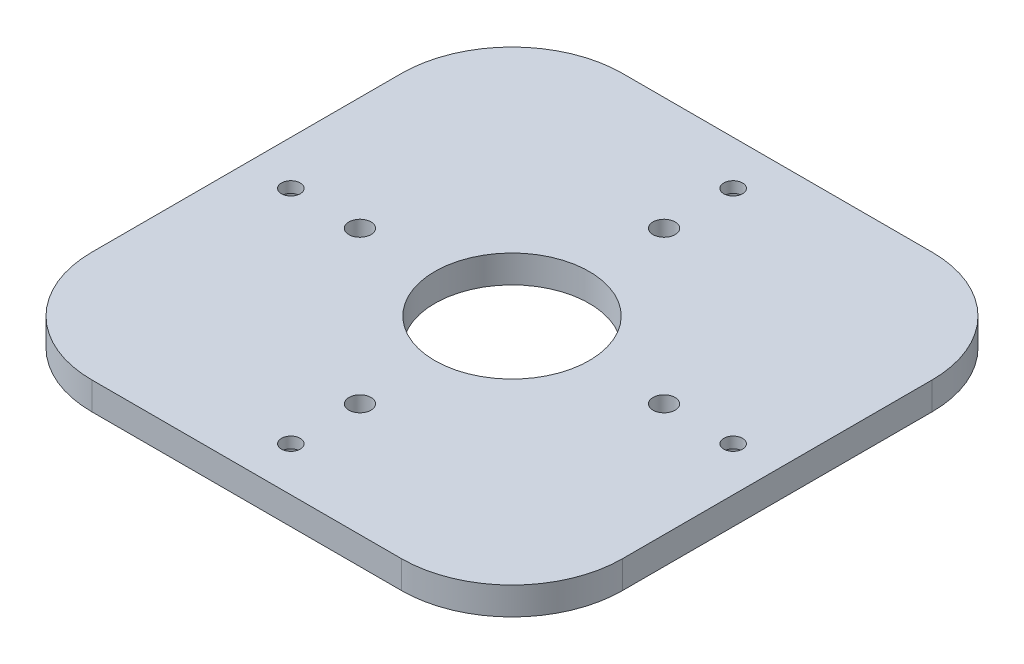
ISO-10303-21;
HEADER;
FILE_DESCRIPTION(('STEP AP214'),'2;1');
FILE_NAME('part.step','',(''),(''),'','','');
FILE_SCHEMA(('AUTOMOTIVE_DESIGN { 1 0 10303 214 1 1 1 1 }'));
ENDSEC;
DATA;
#1=APPLICATION_CONTEXT('core data for automotive mechanical design processes');
#2=APPLICATION_PROTOCOL_DEFINITION('international standard','automotive_design',2000,#1);
#3=PRODUCT_CONTEXT('',#1,'mechanical');
#4=PRODUCT('Part','Part','',(#3));
#5=PRODUCT_RELATED_PRODUCT_CATEGORY('part','',(#4));
#6=PRODUCT_DEFINITION_FORMATION('','',#4);
#7=PRODUCT_DEFINITION_CONTEXT('part definition',#1,'design');
#8=PRODUCT_DEFINITION('design','',#6,#7);
#9=PRODUCT_DEFINITION_SHAPE('','',#8);
#10=(LENGTH_UNIT() NAMED_UNIT(*) SI_UNIT(.MILLI.,.METRE.));
#11=(NAMED_UNIT(*) PLANE_ANGLE_UNIT() SI_UNIT($,.RADIAN.));
#12=(NAMED_UNIT(*) SI_UNIT($,.STERADIAN.) SOLID_ANGLE_UNIT());
#13=UNCERTAINTY_MEASURE_WITH_UNIT(LENGTH_MEASURE(1.E-05),#10,'distance_accuracy_value','');
#14=(GEOMETRIC_REPRESENTATION_CONTEXT(3) GLOBAL_UNCERTAINTY_ASSIGNED_CONTEXT((#13)) GLOBAL_UNIT_ASSIGNED_CONTEXT((#10,
#11,#12)) REPRESENTATION_CONTEXT('',''));
#15=CARTESIAN_POINT('',(0.,0.,0.));
#16=DIRECTION('',(0.,0.,1.));
#17=DIRECTION('',(1.,0.,0.));
#18=AXIS2_PLACEMENT_3D('',#15,#16,#17);
#19=CARTESIAN_POINT('',(0.,5.,0.));
#20=DIRECTION('',(0.,1.,0.));
#21=DIRECTION('',(0.,0.,1.));
#22=AXIS2_PLACEMENT_3D('',#19,#20,#21);
#23=PLANE('',#22);
#24=CARTESIAN_POINT('',(-27.5,5.,0.));
#25=DIRECTION('',(0.,-1.,0.));
#26=DIRECTION('',(0.,0.,-1.));
#27=AXIS2_PLACEMENT_3D('',#24,#25,#26);
#28=CIRCLE('',#27,2.);
#29=CARTESIAN_POINT('',(-27.5,5.,-2.));
#30=VERTEX_POINT('',#29);
#31=EDGE_CURVE('E250',#30,#30,#28,.T.);
#32=ORIENTED_EDGE('',*,*,#31,.T.);
#33=EDGE_LOOP('',(#32));
#34=FACE_BOUND('',#33,.T.);
#35=CARTESIAN_POINT('',(0.,5.,27.5));
#36=DIRECTION('',(0.,-1.,0.));
#37=DIRECTION('',(0.,0.,-1.));
#38=AXIS2_PLACEMENT_3D('',#35,#36,#37);
#39=CIRCLE('',#38,2.);
#40=CARTESIAN_POINT('',(0.,5.,25.5));
#41=VERTEX_POINT('',#40);
#42=EDGE_CURVE('E263',#41,#41,#39,.T.);
#43=ORIENTED_EDGE('',*,*,#42,.T.);
#44=EDGE_LOOP('',(#43));
#45=FACE_BOUND('',#44,.T.);
#46=CARTESIAN_POINT('',(27.5,5.,-1.92031473636372E-13));
#47=DIRECTION('',(0.,-1.,0.));
#48=DIRECTION('',(0.,0.,-1.));
#49=AXIS2_PLACEMENT_3D('',#46,#47,#48);
#50=CIRCLE('',#49,2.);
#51=CARTESIAN_POINT('',(27.5,5.,-2.00000000000019));
#52=VERTEX_POINT('',#51);
#53=EDGE_CURVE('E257',#52,#52,#50,.T.);
#54=ORIENTED_EDGE('',*,*,#53,.T.);
#55=EDGE_LOOP('',(#54));
#56=FACE_BOUND('',#55,.T.);
#57=CARTESIAN_POINT('',(-2.88047210454558E-13,5.,-27.5));
#58=DIRECTION('',(0.,-1.,0.));
#59=DIRECTION('',(0.,0.,-1.));
#60=AXIS2_PLACEMENT_3D('',#57,#58,#59);
#61=CIRCLE('',#60,2.);
#62=CARTESIAN_POINT('',(-2.88047210454558E-13,5.,-29.5));
#63=VERTEX_POINT('',#62);
#64=EDGE_CURVE('E251',#63,#63,#61,.T.);
#65=ORIENTED_EDGE('',*,*,#64,.T.);
#66=EDGE_LOOP('',(#65));
#67=FACE_BOUND('',#66,.T.);
#68=CARTESIAN_POINT('',(-40.,5.,0.));
#69=DIRECTION('',(0.,-1.,0.));
#70=DIRECTION('',(0.,0.,-1.));
#71=AXIS2_PLACEMENT_3D('',#68,#69,#70);
#72=CIRCLE('',#71,1.7);
#73=CARTESIAN_POINT('',(-40.,5.,-1.70000000000002));
#74=VERTEX_POINT('',#73);
#75=EDGE_CURVE('E235',#74,#74,#72,.T.);
#76=ORIENTED_EDGE('',*,*,#75,.T.);
#77=EDGE_LOOP('',(#76));
#78=FACE_BOUND('',#77,.T.);
#79=CARTESIAN_POINT('',(0.,5.,40.));
#80=DIRECTION('',(0.,-1.,0.));
#81=DIRECTION('',(0.,0.,-1.));
#82=AXIS2_PLACEMENT_3D('',#79,#80,#81);
#83=CIRCLE('',#82,1.7);
#84=CARTESIAN_POINT('',(0.,5.,38.3));
#85=VERTEX_POINT('',#84);
#86=EDGE_CURVE('E220',#85,#85,#83,.T.);
#87=ORIENTED_EDGE('',*,*,#86,.T.);
#88=EDGE_LOOP('',(#87));
#89=FACE_BOUND('',#88,.T.);
#90=CARTESIAN_POINT('',(40.,5.,0.));
#91=DIRECTION('',(0.,-1.,0.));
#92=DIRECTION('',(0.,0.,-1.));
#93=AXIS2_PLACEMENT_3D('',#90,#91,#92);
#94=CIRCLE('',#93,1.7);
#95=CARTESIAN_POINT('',(40.,5.,-1.70000000000002));
#96=VERTEX_POINT('',#95);
#97=EDGE_CURVE('E205',#96,#96,#94,.T.);
#98=ORIENTED_EDGE('',*,*,#97,.T.);
#99=EDGE_LOOP('',(#98));
#100=FACE_BOUND('',#99,.T.);
#101=CARTESIAN_POINT('',(0.,5.,-40.));
#102=DIRECTION('',(0.,-1.,0.));
#103=DIRECTION('',(0.,0.,-1.));
#104=AXIS2_PLACEMENT_3D('',#101,#102,#103);
#105=CIRCLE('',#104,1.7);
#106=CARTESIAN_POINT('',(0.,5.,-41.7));
#107=VERTEX_POINT('',#106);
#108=EDGE_CURVE('E189',#107,#107,#105,.T.);
#109=ORIENTED_EDGE('',*,*,#108,.T.);
#110=EDGE_LOOP('',(#109));
#111=FACE_BOUND('',#110,.T.);
#112=DIRECTION('',(-1.,0.,0.));
#113=VECTOR('',#112,1.);
#114=CARTESIAN_POINT('',(-48.,5.,-48.));
#115=LINE('',#114,#113);
#116=CARTESIAN_POINT('',(28.,5.,-48.));
#117=VERTEX_POINT('',#116);
#118=CARTESIAN_POINT('',(-28.,5.,-48.));
#119=VERTEX_POINT('',#118);
#120=EDGE_CURVE('E144',#117,#119,#115,.T.);
#121=ORIENTED_EDGE('',*,*,#120,.T.);
#122=CARTESIAN_POINT('',(-28.,5.,-28.));
#123=DIRECTION('',(0.,1.,0.));
#124=DIRECTION('',(0.,0.,1.));
#125=AXIS2_PLACEMENT_3D('',#122,#123,#124);
#126=CIRCLE('',#125,20.);
#127=CARTESIAN_POINT('',(-48.,5.,-28.));
#128=VERTEX_POINT('',#127);
#129=EDGE_CURVE('E163',#119,#128,#126,.T.);
#130=ORIENTED_EDGE('',*,*,#129,.T.);
#131=DIRECTION('',(0.,0.,1.));
#132=VECTOR('',#131,1.);
#133=CARTESIAN_POINT('',(-48.,5.,-48.));
#134=LINE('',#133,#132);
#135=CARTESIAN_POINT('',(-48.,5.,28.));
#136=VERTEX_POINT('',#135);
#137=EDGE_CURVE('E127',#128,#136,#134,.T.);
#138=ORIENTED_EDGE('',*,*,#137,.T.);
#139=CARTESIAN_POINT('',(-28.,5.,28.));
#140=DIRECTION('',(0.,1.,0.));
#141=DIRECTION('',(0.,0.,1.));
#142=AXIS2_PLACEMENT_3D('',#139,#140,#141);
#143=CIRCLE('',#142,20.);
#144=CARTESIAN_POINT('',(-28.,5.,48.));
#145=VERTEX_POINT('',#144);
#146=EDGE_CURVE('E158',#136,#145,#143,.T.);
#147=ORIENTED_EDGE('',*,*,#146,.T.);
#148=DIRECTION('',(1.,0.,0.));
#149=VECTOR('',#148,1.);
#150=CARTESIAN_POINT('',(-48.,5.,48.));
#151=LINE('',#150,#149);
#152=CARTESIAN_POINT('',(28.,5.,48.));
#153=VERTEX_POINT('',#152);
#154=EDGE_CURVE('E174',#145,#153,#151,.T.);
#155=ORIENTED_EDGE('',*,*,#154,.T.);
#156=CARTESIAN_POINT('',(28.,5.,28.));
#157=DIRECTION('',(0.,1.,0.));
#158=DIRECTION('',(0.,0.,1.));
#159=AXIS2_PLACEMENT_3D('',#156,#157,#158);
#160=CIRCLE('',#159,20.);
#161=CARTESIAN_POINT('',(48.,5.,28.));
#162=VERTEX_POINT('',#161);
#163=EDGE_CURVE('E63',#153,#162,#160,.T.);
#164=ORIENTED_EDGE('',*,*,#163,.T.);
#165=DIRECTION('',(0.,0.,-1.));
#166=VECTOR('',#165,1.);
#167=CARTESIAN_POINT('',(48.,5.,-48.));
#168=LINE('',#167,#166);
#169=CARTESIAN_POINT('',(48.,5.,-28.));
#170=VERTEX_POINT('',#169);
#171=EDGE_CURVE('E182',#162,#170,#168,.T.);
#172=ORIENTED_EDGE('',*,*,#171,.T.);
#173=CARTESIAN_POINT('',(28.,5.,-28.));
#174=DIRECTION('',(0.,1.,0.));
#175=DIRECTION('',(0.,0.,1.));
#176=AXIS2_PLACEMENT_3D('',#173,#174,#175);
#177=CIRCLE('',#176,20.);
#178=EDGE_CURVE('E161',#170,#117,#177,.T.);
#179=ORIENTED_EDGE('',*,*,#178,.T.);
#180=EDGE_LOOP('',(#121,#130,#138,#147,#155,#164,#172,#179));
#181=FACE_BOUND('',#180,.T.);
#182=CARTESIAN_POINT('',(0.,5.,0.));
#183=DIRECTION('',(0.,1.,0.));
#184=DIRECTION('',(0.,0.,1.));
#185=AXIS2_PLACEMENT_3D('',#182,#183,#184);
#186=CIRCLE('',#185,13.97);
#187=CARTESIAN_POINT('',(0.,5.,13.97));
#188=VERTEX_POINT('',#187);
#189=EDGE_CURVE('E135',#188,#188,#186,.T.);
#190=ORIENTED_EDGE('',*,*,#189,.F.);
#191=EDGE_LOOP('',(#190));
#192=FACE_BOUND('',#191,.T.);
#193=ADVANCED_FACE('F41',(#34,#45,#56,#67,#78,#89,#100,#111,#181,#192),#23,.T.);
#194=CARTESIAN_POINT('',(0.,0.,0.));
#195=DIRECTION('',(0.,1.,0.));
#196=DIRECTION('',(0.,0.,1.));
#197=AXIS2_PLACEMENT_3D('',#194,#195,#196);
#198=PLANE('',#197);
#199=CARTESIAN_POINT('',(-27.5,0.,0.));
#200=DIRECTION('',(0.,-1.,0.));
#201=DIRECTION('',(0.,0.,-1.));
#202=AXIS2_PLACEMENT_3D('',#199,#200,#201);
#203=CIRCLE('',#202,2.);
#204=CARTESIAN_POINT('',(-27.5,0.,-2.));
#205=VERTEX_POINT('',#204);
#206=EDGE_CURVE('E269',#205,#205,#203,.T.);
#207=ORIENTED_EDGE('',*,*,#206,.F.);
#208=EDGE_LOOP('',(#207));
#209=FACE_BOUND('',#208,.T.);
#210=CARTESIAN_POINT('',(0.,0.,27.5));
#211=DIRECTION('',(0.,-1.,0.));
#212=DIRECTION('',(0.,0.,-1.));
#213=AXIS2_PLACEMENT_3D('',#210,#211,#212);
#214=CIRCLE('',#213,2.);
#215=CARTESIAN_POINT('',(0.,0.,25.5));
#216=VERTEX_POINT('',#215);
#217=EDGE_CURVE('E266',#216,#216,#214,.T.);
#218=ORIENTED_EDGE('',*,*,#217,.F.);
#219=EDGE_LOOP('',(#218));
#220=FACE_BOUND('',#219,.T.);
#221=CARTESIAN_POINT('',(27.5,0.,-1.92031473636372E-13));
#222=DIRECTION('',(0.,-1.,0.));
#223=DIRECTION('',(0.,0.,-1.));
#224=AXIS2_PLACEMENT_3D('',#221,#222,#223);
#225=CIRCLE('',#224,2.);
#226=CARTESIAN_POINT('',(27.5,0.,-2.00000000000019));
#227=VERTEX_POINT('',#226);
#228=EDGE_CURVE('E260',#227,#227,#225,.T.);
#229=ORIENTED_EDGE('',*,*,#228,.F.);
#230=EDGE_LOOP('',(#229));
#231=FACE_BOUND('',#230,.T.);
#232=CARTESIAN_POINT('',(-2.88047210454558E-13,0.,-27.5));
#233=DIRECTION('',(0.,-1.,0.));
#234=DIRECTION('',(0.,0.,-1.));
#235=AXIS2_PLACEMENT_3D('',#232,#233,#234);
#236=CIRCLE('',#235,2.);
#237=CARTESIAN_POINT('',(-2.88047210454558E-13,0.,-29.5));
#238=VERTEX_POINT('',#237);
#239=EDGE_CURVE('E254',#238,#238,#236,.T.);
#240=ORIENTED_EDGE('',*,*,#239,.F.);
#241=EDGE_LOOP('',(#240));
#242=FACE_BOUND('',#241,.T.);
#243=CARTESIAN_POINT('',(-40.,0.,0.));
#244=DIRECTION('',(0.,-1.,0.));
#245=DIRECTION('',(0.,0.,-1.));
#246=AXIS2_PLACEMENT_3D('',#243,#244,#245);
#247=CIRCLE('',#246,3.275);
#248=CARTESIAN_POINT('',(-40.,0.,-3.27500000000002));
#249=VERTEX_POINT('',#248);
#250=EDGE_CURVE('E247',#249,#249,#247,.T.);
#251=ORIENTED_EDGE('',*,*,#250,.F.);
#252=EDGE_LOOP('',(#251));
#253=FACE_BOUND('',#252,.T.);
#254=CARTESIAN_POINT('',(0.,0.,40.));
#255=DIRECTION('',(0.,-1.,0.));
#256=DIRECTION('',(0.,0.,-1.));
#257=AXIS2_PLACEMENT_3D('',#254,#255,#256);
#258=CIRCLE('',#257,3.275);
#259=CARTESIAN_POINT('',(0.,0.,36.725));
#260=VERTEX_POINT('',#259);
#261=EDGE_CURVE('E232',#260,#260,#258,.T.);
#262=ORIENTED_EDGE('',*,*,#261,.F.);
#263=EDGE_LOOP('',(#262));
#264=FACE_BOUND('',#263,.T.);
#265=CARTESIAN_POINT('',(40.,0.,0.));
#266=DIRECTION('',(0.,-1.,0.));
#267=DIRECTION('',(0.,0.,-1.));
#268=AXIS2_PLACEMENT_3D('',#265,#266,#267);
#269=CIRCLE('',#268,3.275);
#270=CARTESIAN_POINT('',(40.,0.,-3.27500000000002));
#271=VERTEX_POINT('',#270);
#272=EDGE_CURVE('E217',#271,#271,#269,.T.);
#273=ORIENTED_EDGE('',*,*,#272,.F.);
#274=EDGE_LOOP('',(#273));
#275=FACE_BOUND('',#274,.T.);
#276=CARTESIAN_POINT('',(0.,0.,-40.));
#277=DIRECTION('',(0.,-1.,0.));
#278=DIRECTION('',(0.,0.,-1.));
#279=AXIS2_PLACEMENT_3D('',#276,#277,#278);
#280=CIRCLE('',#279,3.275);
#281=CARTESIAN_POINT('',(0.,0.,-43.275));
#282=VERTEX_POINT('',#281);
#283=EDGE_CURVE('E202',#282,#282,#280,.T.);
#284=ORIENTED_EDGE('',*,*,#283,.F.);
#285=EDGE_LOOP('',(#284));
#286=FACE_BOUND('',#285,.T.);
#287=DIRECTION('',(0.,0.,1.));
#288=VECTOR('',#287,1.);
#289=CARTESIAN_POINT('',(-48.,0.,-48.));
#290=LINE('',#289,#288);
#291=CARTESIAN_POINT('',(-48.,0.,-28.));
#292=VERTEX_POINT('',#291);
#293=CARTESIAN_POINT('',(-48.,0.,28.));
#294=VERTEX_POINT('',#293);
#295=EDGE_CURVE('E124',#292,#294,#290,.T.);
#296=ORIENTED_EDGE('',*,*,#295,.F.);
#297=CARTESIAN_POINT('',(-28.,0.,-28.));
#298=DIRECTION('',(0.,1.,0.));
#299=DIRECTION('',(0.,0.,1.));
#300=AXIS2_PLACEMENT_3D('',#297,#298,#299);
#301=CIRCLE('',#300,20.);
#302=CARTESIAN_POINT('',(-28.,0.,-48.));
#303=VERTEX_POINT('',#302);
#304=EDGE_CURVE('E107',#292,#303,#301,.F.);
#305=ORIENTED_EDGE('',*,*,#304,.T.);
#306=DIRECTION('',(-1.,0.,0.));
#307=VECTOR('',#306,1.);
#308=CARTESIAN_POINT('',(-48.,0.,-48.));
#309=LINE('',#308,#307);
#310=CARTESIAN_POINT('',(28.,0.,-48.));
#311=VERTEX_POINT('',#310);
#312=EDGE_CURVE('E148',#311,#303,#309,.T.);
#313=ORIENTED_EDGE('',*,*,#312,.F.);
#314=CARTESIAN_POINT('',(28.,0.,-28.));
#315=DIRECTION('',(0.,1.,0.));
#316=DIRECTION('',(0.,0.,1.));
#317=AXIS2_PLACEMENT_3D('',#314,#315,#316);
#318=CIRCLE('',#317,20.);
#319=CARTESIAN_POINT('',(48.,0.,-28.));
#320=VERTEX_POINT('',#319);
#321=EDGE_CURVE('E118',#311,#320,#318,.F.);
#322=ORIENTED_EDGE('',*,*,#321,.T.);
#323=DIRECTION('',(0.,0.,-1.));
#324=VECTOR('',#323,1.);
#325=CARTESIAN_POINT('',(48.,0.,-48.));
#326=LINE('',#325,#324);
#327=CARTESIAN_POINT('',(48.,0.,28.));
#328=VERTEX_POINT('',#327);
#329=EDGE_CURVE('E138',#328,#320,#326,.T.);
#330=ORIENTED_EDGE('',*,*,#329,.F.);
#331=CARTESIAN_POINT('',(28.,0.,28.));
#332=DIRECTION('',(0.,1.,0.));
#333=DIRECTION('',(0.,0.,1.));
#334=AXIS2_PLACEMENT_3D('',#331,#332,#333);
#335=CIRCLE('',#334,20.);
#336=CARTESIAN_POINT('',(28.,0.,48.));
#337=VERTEX_POINT('',#336);
#338=EDGE_CURVE('E152',#328,#337,#335,.F.);
#339=ORIENTED_EDGE('',*,*,#338,.T.);
#340=DIRECTION('',(1.,0.,0.));
#341=VECTOR('',#340,1.);
#342=CARTESIAN_POINT('',(-48.,0.,48.));
#343=LINE('',#342,#341);
#344=CARTESIAN_POINT('',(-28.,0.,48.));
#345=VERTEX_POINT('',#344);
#346=EDGE_CURVE('E134',#345,#337,#343,.T.);
#347=ORIENTED_EDGE('',*,*,#346,.F.);
#348=CARTESIAN_POINT('',(-28.,0.,28.));
#349=DIRECTION('',(0.,1.,0.));
#350=DIRECTION('',(0.,0.,1.));
#351=AXIS2_PLACEMENT_3D('',#348,#349,#350);
#352=CIRCLE('',#351,20.);
#353=EDGE_CURVE('E128',#345,#294,#352,.F.);
#354=ORIENTED_EDGE('',*,*,#353,.T.);
#355=EDGE_LOOP('',(#296,#305,#313,#322,#330,#339,#347,#354));
#356=FACE_BOUND('',#355,.T.);
#357=CARTESIAN_POINT('',(0.,0.,0.));
#358=DIRECTION('',(0.,1.,0.));
#359=DIRECTION('',(0.,0.,1.));
#360=AXIS2_PLACEMENT_3D('',#357,#358,#359);
#361=CIRCLE('',#360,13.97);
#362=CARTESIAN_POINT('',(0.,0.,13.97));
#363=VERTEX_POINT('',#362);
#364=EDGE_CURVE('E141',#363,#363,#361,.T.);
#365=ORIENTED_EDGE('',*,*,#364,.T.);
#366=EDGE_LOOP('',(#365));
#367=FACE_BOUND('',#366,.T.);
#368=ADVANCED_FACE('F131',(#209,#220,#231,#242,#253,#264,#275,#286,#356,#367),#198,.F.);
#369=CARTESIAN_POINT('',(-48.,5.,-48.));
#370=DIRECTION('',(1.,0.,0.));
#371=DIRECTION('',(0.,0.,-1.));
#372=AXIS2_PLACEMENT_3D('',#369,#370,#371);
#373=PLANE('',#372);
#374=ORIENTED_EDGE('',*,*,#137,.F.);
#375=DIRECTION('',(0.,-1.,0.));
#376=VECTOR('',#375,1.);
#377=CARTESIAN_POINT('',(-48.,5.,-28.));
#378=LINE('',#377,#376);
#379=EDGE_CURVE('E111',#128,#292,#378,.T.);
#380=ORIENTED_EDGE('',*,*,#379,.T.);
#381=ORIENTED_EDGE('',*,*,#295,.T.);
#382=DIRECTION('',(0.,-1.,0.));
#383=VECTOR('',#382,1.);
#384=CARTESIAN_POINT('',(-48.,5.,28.));
#385=LINE('',#384,#383);
#386=EDGE_CURVE('E129',#294,#136,#385,.F.);
#387=ORIENTED_EDGE('',*,*,#386,.T.);
#388=EDGE_LOOP('',(#374,#380,#381,#387));
#389=FACE_BOUND('',#388,.T.);
#390=ADVANCED_FACE('F123',(#389),#373,.F.);
#391=CARTESIAN_POINT('',(-48.,5.,48.));
#392=DIRECTION('',(0.,0.,-1.));
#393=DIRECTION('',(-1.,0.,0.));
#394=AXIS2_PLACEMENT_3D('',#391,#392,#393);
#395=PLANE('',#394);
#396=ORIENTED_EDGE('',*,*,#346,.T.);
#397=DIRECTION('',(0.,-1.,0.));
#398=VECTOR('',#397,1.);
#399=CARTESIAN_POINT('',(28.,5.,48.));
#400=LINE('',#399,#398);
#401=EDGE_CURVE('E11',#337,#153,#400,.F.);
#402=ORIENTED_EDGE('',*,*,#401,.T.);
#403=ORIENTED_EDGE('',*,*,#154,.F.);
#404=DIRECTION('',(0.,-1.,0.));
#405=VECTOR('',#404,1.);
#406=CARTESIAN_POINT('',(-28.,5.,48.));
#407=LINE('',#406,#405);
#408=EDGE_CURVE('E49',#145,#345,#407,.T.);
#409=ORIENTED_EDGE('',*,*,#408,.T.);
#410=EDGE_LOOP('',(#396,#402,#403,#409));
#411=FACE_BOUND('',#410,.T.);
#412=ADVANCED_FACE('F172',(#411),#395,.F.);
#413=CARTESIAN_POINT('',(48.,5.,-48.));
#414=DIRECTION('',(-1.,0.,0.));
#415=DIRECTION('',(0.,0.,1.));
#416=AXIS2_PLACEMENT_3D('',#413,#414,#415);
#417=PLANE('',#416);
#418=ORIENTED_EDGE('',*,*,#329,.T.);
#419=DIRECTION('',(0.,-1.,0.));
#420=VECTOR('',#419,1.);
#421=CARTESIAN_POINT('',(48.,5.,-28.));
#422=LINE('',#421,#420);
#423=EDGE_CURVE('E56',#320,#170,#422,.F.);
#424=ORIENTED_EDGE('',*,*,#423,.T.);
#425=ORIENTED_EDGE('',*,*,#171,.F.);
#426=DIRECTION('',(0.,-1.,0.));
#427=VECTOR('',#426,1.);
#428=CARTESIAN_POINT('',(48.,5.,28.));
#429=LINE('',#428,#427);
#430=EDGE_CURVE('E165',#162,#328,#429,.T.);
#431=ORIENTED_EDGE('',*,*,#430,.T.);
#432=EDGE_LOOP('',(#418,#424,#425,#431));
#433=FACE_BOUND('',#432,.T.);
#434=ADVANCED_FACE('F181',(#433),#417,.F.);
#435=CARTESIAN_POINT('',(-48.,5.,-48.));
#436=DIRECTION('',(0.,0.,1.));
#437=DIRECTION('',(1.,0.,0.));
#438=AXIS2_PLACEMENT_3D('',#435,#436,#437);
#439=PLANE('',#438);
#440=ORIENTED_EDGE('',*,*,#312,.T.);
#441=DIRECTION('',(0.,-1.,0.));
#442=VECTOR('',#441,1.);
#443=CARTESIAN_POINT('',(-28.,5.,-48.));
#444=LINE('',#443,#442);
#445=EDGE_CURVE('E112',#303,#119,#444,.F.);
#446=ORIENTED_EDGE('',*,*,#445,.T.);
#447=ORIENTED_EDGE('',*,*,#120,.F.);
#448=DIRECTION('',(0.,-1.,0.));
#449=VECTOR('',#448,1.);
#450=CARTESIAN_POINT('',(28.,5.,-48.));
#451=LINE('',#450,#449);
#452=EDGE_CURVE('E117',#117,#311,#451,.T.);
#453=ORIENTED_EDGE('',*,*,#452,.T.);
#454=EDGE_LOOP('',(#440,#446,#447,#453));
#455=FACE_BOUND('',#454,.T.);
#456=ADVANCED_FACE('F327',(#455),#439,.F.);
#457=CARTESIAN_POINT('',(0.,5.,0.));
#458=DIRECTION('',(0.,-1.,0.));
#459=DIRECTION('',(0.,0.,-1.));
#460=AXIS2_PLACEMENT_3D('',#457,#458,#459);
#461=CYLINDRICAL_SURFACE('',#460,13.97);
#462=ORIENTED_EDGE('',*,*,#189,.T.);
#463=EDGE_LOOP('',(#462));
#464=FACE_BOUND('',#463,.T.);
#465=ORIENTED_EDGE('',*,*,#364,.F.);
#466=EDGE_LOOP('',(#465));
#467=FACE_BOUND('',#466,.T.);
#468=ADVANCED_FACE('F324',(#464,#467),#461,.F.);
#469=CARTESIAN_POINT('',(-28.,5.,-28.));
#470=DIRECTION('',(0.,-1.,0.));
#471=DIRECTION('',(0.,0.,-1.));
#472=AXIS2_PLACEMENT_3D('',#469,#470,#471);
#473=CYLINDRICAL_SURFACE('',#472,20.);
#474=ORIENTED_EDGE('',*,*,#129,.F.);
#475=ORIENTED_EDGE('',*,*,#445,.F.);
#476=ORIENTED_EDGE('',*,*,#304,.F.);
#477=ORIENTED_EDGE('',*,*,#379,.F.);
#478=EDGE_LOOP('',(#474,#475,#476,#477));
#479=FACE_BOUND('',#478,.T.);
#480=ADVANCED_FACE('F110',(#479),#473,.T.);
#481=CARTESIAN_POINT('',(28.,5.,-28.));
#482=DIRECTION('',(0.,-1.,0.));
#483=DIRECTION('',(0.,0.,-1.));
#484=AXIS2_PLACEMENT_3D('',#481,#482,#483);
#485=CYLINDRICAL_SURFACE('',#484,20.);
#486=ORIENTED_EDGE('',*,*,#178,.F.);
#487=ORIENTED_EDGE('',*,*,#423,.F.);
#488=ORIENTED_EDGE('',*,*,#321,.F.);
#489=ORIENTED_EDGE('',*,*,#452,.F.);
#490=EDGE_LOOP('',(#486,#487,#488,#489));
#491=FACE_BOUND('',#490,.T.);
#492=ADVANCED_FACE('F339',(#491),#485,.T.);
#493=CARTESIAN_POINT('',(28.,5.,28.));
#494=DIRECTION('',(0.,-1.,0.));
#495=DIRECTION('',(0.,0.,-1.));
#496=AXIS2_PLACEMENT_3D('',#493,#494,#495);
#497=CYLINDRICAL_SURFACE('',#496,20.);
#498=ORIENTED_EDGE('',*,*,#163,.F.);
#499=ORIENTED_EDGE('',*,*,#401,.F.);
#500=ORIENTED_EDGE('',*,*,#338,.F.);
#501=ORIENTED_EDGE('',*,*,#430,.F.);
#502=EDGE_LOOP('',(#498,#499,#500,#501));
#503=FACE_BOUND('',#502,.T.);
#504=ADVANCED_FACE('F180',(#503),#497,.T.);
#505=CARTESIAN_POINT('',(-28.,5.,28.));
#506=DIRECTION('',(0.,-1.,0.));
#507=DIRECTION('',(0.,0.,-1.));
#508=AXIS2_PLACEMENT_3D('',#505,#506,#507);
#509=CYLINDRICAL_SURFACE('',#508,20.);
#510=ORIENTED_EDGE('',*,*,#146,.F.);
#511=ORIENTED_EDGE('',*,*,#386,.F.);
#512=ORIENTED_EDGE('',*,*,#353,.F.);
#513=ORIENTED_EDGE('',*,*,#408,.F.);
#514=EDGE_LOOP('',(#510,#511,#512,#513));
#515=FACE_BOUND('',#514,.T.);
#516=ADVANCED_FACE('F43',(#515),#509,.T.);
#517=CARTESIAN_POINT('',(0.,0.,-40.));
#518=DIRECTION('',(0.,-1.,0.));
#519=DIRECTION('',(0.,0.,-1.));
#520=AXIS2_PLACEMENT_3D('',#517,#518,#519);
#521=CYLINDRICAL_SURFACE('',#520,1.7);
#522=ORIENTED_EDGE('',*,*,#108,.F.);
#523=EDGE_LOOP('',(#522));
#524=FACE_BOUND('',#523,.T.);
#525=CARTESIAN_POINT('',(0.,3.,-40.));
#526=DIRECTION('',(0.,-1.,0.));
#527=DIRECTION('',(0.,0.,-1.));
#528=AXIS2_PLACEMENT_3D('',#525,#526,#527);
#529=CIRCLE('',#528,1.7);
#530=CARTESIAN_POINT('',(0.,3.,-41.7));
#531=VERTEX_POINT('',#530);
#532=EDGE_CURVE('E193',#531,#531,#529,.T.);
#533=ORIENTED_EDGE('',*,*,#532,.T.);
#534=EDGE_LOOP('',(#533));
#535=FACE_BOUND('',#534,.T.);
#536=ADVANCED_FACE('F346',(#524,#535),#521,.F.);
#537=CARTESIAN_POINT('',(3.25,3.,-40.));
#538=DIRECTION('',(0.,1.,0.));
#539=DIRECTION('',(0.,0.,1.));
#540=AXIS2_PLACEMENT_3D('',#537,#538,#539);
#541=PLANE('',#540);
#542=ORIENTED_EDGE('',*,*,#532,.F.);
#543=EDGE_LOOP('',(#542));
#544=FACE_BOUND('',#543,.T.);
#545=CARTESIAN_POINT('',(0.,3.,-40.));
#546=DIRECTION('',(0.,-1.,0.));
#547=DIRECTION('',(0.,0.,-1.));
#548=AXIS2_PLACEMENT_3D('',#545,#546,#547);
#549=CIRCLE('',#548,3.25);
#550=CARTESIAN_POINT('',(0.,3.,-43.25));
#551=VERTEX_POINT('',#550);
#552=EDGE_CURVE('E196',#551,#551,#549,.T.);
#553=ORIENTED_EDGE('',*,*,#552,.T.);
#554=EDGE_LOOP('',(#553));
#555=FACE_BOUND('',#554,.T.);
#556=ADVANCED_FACE('F314',(#544,#555),#541,.F.);
#557=CARTESIAN_POINT('',(0.,0.,-40.));
#558=DIRECTION('',(0.,-1.,0.));
#559=DIRECTION('',(0.,0.,-1.));
#560=AXIS2_PLACEMENT_3D('',#557,#558,#559);
#561=CYLINDRICAL_SURFACE('',#560,3.25);
#562=ORIENTED_EDGE('',*,*,#552,.F.);
#563=EDGE_LOOP('',(#562));
#564=FACE_BOUND('',#563,.T.);
#565=CARTESIAN_POINT('',(0.,0.0250000000000001,-40.));
#566=DIRECTION('',(0.,-1.,0.));
#567=DIRECTION('',(0.,0.,-1.));
#568=AXIS2_PLACEMENT_3D('',#565,#566,#567);
#569=CIRCLE('',#568,3.25);
#570=CARTESIAN_POINT('',(0.,0.0250000000000001,-43.25));
#571=VERTEX_POINT('',#570);
#572=EDGE_CURVE('E199',#571,#571,#569,.T.);
#573=ORIENTED_EDGE('',*,*,#572,.T.);
#574=EDGE_LOOP('',(#573));
#575=FACE_BOUND('',#574,.T.);
#576=ADVANCED_FACE('F304',(#564,#575),#561,.F.);
#577=CARTESIAN_POINT('',(0.,0.,-40.));
#578=DIRECTION('',(0.,-1.,0.));
#579=DIRECTION('',(0.,0.,-1.));
#580=AXIS2_PLACEMENT_3D('',#577,#578,#579);
#581=CONICAL_SURFACE('',#580,3.275,0.785398163397453);
#582=ORIENTED_EDGE('',*,*,#572,.F.);
#583=EDGE_LOOP('',(#582));
#584=FACE_BOUND('',#583,.T.);
#585=ORIENTED_EDGE('',*,*,#283,.T.);
#586=EDGE_LOOP('',(#585));
#587=FACE_BOUND('',#586,.T.);
#588=ADVANCED_FACE('F301',(#584,#587),#581,.F.);
#589=CARTESIAN_POINT('',(40.,0.,0.));
#590=DIRECTION('',(0.,-1.,0.));
#591=DIRECTION('',(0.,0.,-1.));
#592=AXIS2_PLACEMENT_3D('',#589,#590,#591);
#593=CYLINDRICAL_SURFACE('',#592,1.7);
#594=ORIENTED_EDGE('',*,*,#97,.F.);
#595=EDGE_LOOP('',(#594));
#596=FACE_BOUND('',#595,.T.);
#597=CARTESIAN_POINT('',(40.,3.,0.));
#598=DIRECTION('',(0.,-1.,0.));
#599=DIRECTION('',(0.,0.,-1.));
#600=AXIS2_PLACEMENT_3D('',#597,#598,#599);
#601=CIRCLE('',#600,1.7);
#602=CARTESIAN_POINT('',(40.,3.,-1.70000000000002));
#603=VERTEX_POINT('',#602);
#604=EDGE_CURVE('E208',#603,#603,#601,.T.);
#605=ORIENTED_EDGE('',*,*,#604,.T.);
#606=EDGE_LOOP('',(#605));
#607=FACE_BOUND('',#606,.T.);
#608=ADVANCED_FACE('F303',(#596,#607),#593,.F.);
#609=CARTESIAN_POINT('',(43.25,3.,0.));
#610=DIRECTION('',(0.,1.,0.));
#611=DIRECTION('',(0.,0.,1.));
#612=AXIS2_PLACEMENT_3D('',#609,#610,#611);
#613=PLANE('',#612);
#614=ORIENTED_EDGE('',*,*,#604,.F.);
#615=EDGE_LOOP('',(#614));
#616=FACE_BOUND('',#615,.T.);
#617=CARTESIAN_POINT('',(40.,3.,0.));
#618=DIRECTION('',(0.,-1.,0.));
#619=DIRECTION('',(0.,0.,-1.));
#620=AXIS2_PLACEMENT_3D('',#617,#618,#619);
#621=CIRCLE('',#620,3.25);
#622=CARTESIAN_POINT('',(40.,3.,-3.25000000000002));
#623=VERTEX_POINT('',#622);
#624=EDGE_CURVE('E211',#623,#623,#621,.T.);
#625=ORIENTED_EDGE('',*,*,#624,.T.);
#626=EDGE_LOOP('',(#625));
#627=FACE_BOUND('',#626,.T.);
#628=ADVANCED_FACE('F311',(#616,#627),#613,.F.);
#629=CARTESIAN_POINT('',(40.,0.,0.));
#630=DIRECTION('',(0.,-1.,0.));
#631=DIRECTION('',(0.,0.,-1.));
#632=AXIS2_PLACEMENT_3D('',#629,#630,#631);
#633=CYLINDRICAL_SURFACE('',#632,3.25);
#634=ORIENTED_EDGE('',*,*,#624,.F.);
#635=EDGE_LOOP('',(#634));
#636=FACE_BOUND('',#635,.T.);
#637=CARTESIAN_POINT('',(40.,0.0250000000000001,0.));
#638=DIRECTION('',(0.,-1.,0.));
#639=DIRECTION('',(0.,0.,-1.));
#640=AXIS2_PLACEMENT_3D('',#637,#638,#639);
#641=CIRCLE('',#640,3.25);
#642=CARTESIAN_POINT('',(40.,0.0250000000000001,-3.25000000000002));
#643=VERTEX_POINT('',#642);
#644=EDGE_CURVE('E214',#643,#643,#641,.T.);
#645=ORIENTED_EDGE('',*,*,#644,.T.);
#646=EDGE_LOOP('',(#645));
#647=FACE_BOUND('',#646,.T.);
#648=ADVANCED_FACE('F428',(#636,#647),#633,.F.);
#649=CARTESIAN_POINT('',(40.,0.,0.));
#650=DIRECTION('',(0.,-1.,0.));
#651=DIRECTION('',(0.,0.,-1.));
#652=AXIS2_PLACEMENT_3D('',#649,#650,#651);
#653=CONICAL_SURFACE('',#652,3.275,0.785398163397392);
#654=ORIENTED_EDGE('',*,*,#644,.F.);
#655=EDGE_LOOP('',(#654));
#656=FACE_BOUND('',#655,.T.);
#657=ORIENTED_EDGE('',*,*,#272,.T.);
#658=EDGE_LOOP('',(#657));
#659=FACE_BOUND('',#658,.T.);
#660=ADVANCED_FACE('F439',(#656,#659),#653,.F.);
#661=CARTESIAN_POINT('',(0.,0.,40.));
#662=DIRECTION('',(0.,-1.,0.));
#663=DIRECTION('',(0.,0.,-1.));
#664=AXIS2_PLACEMENT_3D('',#661,#662,#663);
#665=CYLINDRICAL_SURFACE('',#664,1.7);
#666=ORIENTED_EDGE('',*,*,#86,.F.);
#667=EDGE_LOOP('',(#666));
#668=FACE_BOUND('',#667,.T.);
#669=CARTESIAN_POINT('',(0.,3.,40.));
#670=DIRECTION('',(0.,-1.,0.));
#671=DIRECTION('',(0.,0.,-1.));
#672=AXIS2_PLACEMENT_3D('',#669,#670,#671);
#673=CIRCLE('',#672,1.7);
#674=CARTESIAN_POINT('',(0.,3.,38.3));
#675=VERTEX_POINT('',#674);
#676=EDGE_CURVE('E223',#675,#675,#673,.T.);
#677=ORIENTED_EDGE('',*,*,#676,.T.);
#678=EDGE_LOOP('',(#677));
#679=FACE_BOUND('',#678,.T.);
#680=ADVANCED_FACE('F450',(#668,#679),#665,.F.);
#681=CARTESIAN_POINT('',(3.25,3.,40.));
#682=DIRECTION('',(0.,1.,0.));
#683=DIRECTION('',(0.,0.,1.));
#684=AXIS2_PLACEMENT_3D('',#681,#682,#683);
#685=PLANE('',#684);
#686=ORIENTED_EDGE('',*,*,#676,.F.);
#687=EDGE_LOOP('',(#686));
#688=FACE_BOUND('',#687,.T.);
#689=CARTESIAN_POINT('',(0.,3.,40.));
#690=DIRECTION('',(0.,-1.,0.));
#691=DIRECTION('',(0.,0.,-1.));
#692=AXIS2_PLACEMENT_3D('',#689,#690,#691);
#693=CIRCLE('',#692,3.25);
#694=CARTESIAN_POINT('',(0.,3.,36.75));
#695=VERTEX_POINT('',#694);
#696=EDGE_CURVE('E226',#695,#695,#693,.T.);
#697=ORIENTED_EDGE('',*,*,#696,.T.);
#698=EDGE_LOOP('',(#697));
#699=FACE_BOUND('',#698,.T.);
#700=ADVANCED_FACE('F461',(#688,#699),#685,.F.);
#701=CARTESIAN_POINT('',(0.,0.,40.));
#702=DIRECTION('',(0.,-1.,0.));
#703=DIRECTION('',(0.,0.,-1.));
#704=AXIS2_PLACEMENT_3D('',#701,#702,#703);
#705=CYLINDRICAL_SURFACE('',#704,3.25);
#706=ORIENTED_EDGE('',*,*,#696,.F.);
#707=EDGE_LOOP('',(#706));
#708=FACE_BOUND('',#707,.T.);
#709=CARTESIAN_POINT('',(0.,0.0250000000000001,40.));
#710=DIRECTION('',(0.,-1.,0.));
#711=DIRECTION('',(0.,0.,-1.));
#712=AXIS2_PLACEMENT_3D('',#709,#710,#711);
#713=CIRCLE('',#712,3.25);
#714=CARTESIAN_POINT('',(0.,0.0250000000000001,36.75));
#715=VERTEX_POINT('',#714);
#716=EDGE_CURVE('E229',#715,#715,#713,.T.);
#717=ORIENTED_EDGE('',*,*,#716,.T.);
#718=EDGE_LOOP('',(#717));
#719=FACE_BOUND('',#718,.T.);
#720=ADVANCED_FACE('F472',(#708,#719),#705,.F.);
#721=CARTESIAN_POINT('',(0.,0.,40.));
#722=DIRECTION('',(0.,-1.,0.));
#723=DIRECTION('',(0.,0.,-1.));
#724=AXIS2_PLACEMENT_3D('',#721,#722,#723);
#725=CONICAL_SURFACE('',#724,3.275,0.785398163397453);
#726=ORIENTED_EDGE('',*,*,#716,.F.);
#727=EDGE_LOOP('',(#726));
#728=FACE_BOUND('',#727,.T.);
#729=ORIENTED_EDGE('',*,*,#261,.T.);
#730=EDGE_LOOP('',(#729));
#731=FACE_BOUND('',#730,.T.);
#732=ADVANCED_FACE('F483',(#728,#731),#725,.F.);
#733=CARTESIAN_POINT('',(-40.,0.,0.));
#734=DIRECTION('',(0.,-1.,0.));
#735=DIRECTION('',(0.,0.,-1.));
#736=AXIS2_PLACEMENT_3D('',#733,#734,#735);
#737=CYLINDRICAL_SURFACE('',#736,1.7);
#738=ORIENTED_EDGE('',*,*,#75,.F.);
#739=EDGE_LOOP('',(#738));
#740=FACE_BOUND('',#739,.T.);
#741=CARTESIAN_POINT('',(-40.,3.,0.));
#742=DIRECTION('',(0.,-1.,0.));
#743=DIRECTION('',(0.,0.,-1.));
#744=AXIS2_PLACEMENT_3D('',#741,#742,#743);
#745=CIRCLE('',#744,1.7);
#746=CARTESIAN_POINT('',(-40.,3.,-1.70000000000002));
#747=VERTEX_POINT('',#746);
#748=EDGE_CURVE('E238',#747,#747,#745,.T.);
#749=ORIENTED_EDGE('',*,*,#748,.T.);
#750=EDGE_LOOP('',(#749));
#751=FACE_BOUND('',#750,.T.);
#752=ADVANCED_FACE('F494',(#740,#751),#737,.F.);
#753=CARTESIAN_POINT('',(-36.75,3.,0.));
#754=DIRECTION('',(0.,1.,0.));
#755=DIRECTION('',(0.,0.,1.));
#756=AXIS2_PLACEMENT_3D('',#753,#754,#755);
#757=PLANE('',#756);
#758=ORIENTED_EDGE('',*,*,#748,.F.);
#759=EDGE_LOOP('',(#758));
#760=FACE_BOUND('',#759,.T.);
#761=CARTESIAN_POINT('',(-40.,3.,0.));
#762=DIRECTION('',(0.,-1.,0.));
#763=DIRECTION('',(0.,0.,-1.));
#764=AXIS2_PLACEMENT_3D('',#761,#762,#763);
#765=CIRCLE('',#764,3.25);
#766=CARTESIAN_POINT('',(-40.,3.,-3.25000000000002));
#767=VERTEX_POINT('',#766);
#768=EDGE_CURVE('E241',#767,#767,#765,.T.);
#769=ORIENTED_EDGE('',*,*,#768,.T.);
#770=EDGE_LOOP('',(#769));
#771=FACE_BOUND('',#770,.T.);
#772=ADVANCED_FACE('F505',(#760,#771),#757,.F.);
#773=CARTESIAN_POINT('',(-40.,0.,0.));
#774=DIRECTION('',(0.,-1.,0.));
#775=DIRECTION('',(0.,0.,-1.));
#776=AXIS2_PLACEMENT_3D('',#773,#774,#775);
#777=CYLINDRICAL_SURFACE('',#776,3.25);
#778=ORIENTED_EDGE('',*,*,#768,.F.);
#779=EDGE_LOOP('',(#778));
#780=FACE_BOUND('',#779,.T.);
#781=CARTESIAN_POINT('',(-40.,0.0250000000000001,0.));
#782=DIRECTION('',(0.,-1.,0.));
#783=DIRECTION('',(0.,0.,-1.));
#784=AXIS2_PLACEMENT_3D('',#781,#782,#783);
#785=CIRCLE('',#784,3.25);
#786=CARTESIAN_POINT('',(-40.,0.0250000000000001,-3.25000000000002));
#787=VERTEX_POINT('',#786);
#788=EDGE_CURVE('E244',#787,#787,#785,.T.);
#789=ORIENTED_EDGE('',*,*,#788,.T.);
#790=EDGE_LOOP('',(#789));
#791=FACE_BOUND('',#790,.T.);
#792=ADVANCED_FACE('F516',(#780,#791),#777,.F.);
#793=CARTESIAN_POINT('',(-40.,0.,0.));
#794=DIRECTION('',(0.,-1.,0.));
#795=DIRECTION('',(0.,0.,-1.));
#796=AXIS2_PLACEMENT_3D('',#793,#794,#795);
#797=CONICAL_SURFACE('',#796,3.275,0.785398163397392);
#798=ORIENTED_EDGE('',*,*,#788,.F.);
#799=EDGE_LOOP('',(#798));
#800=FACE_BOUND('',#799,.T.);
#801=ORIENTED_EDGE('',*,*,#250,.T.);
#802=EDGE_LOOP('',(#801));
#803=FACE_BOUND('',#802,.T.);
#804=ADVANCED_FACE('F526',(#800,#803),#797,.F.);
#805=CARTESIAN_POINT('',(-2.88047210454558E-13,5.,-27.5));
#806=DIRECTION('',(0.,-1.,0.));
#807=DIRECTION('',(0.,0.,-1.));
#808=AXIS2_PLACEMENT_3D('',#805,#806,#807);
#809=CYLINDRICAL_SURFACE('',#808,2.);
#810=ORIENTED_EDGE('',*,*,#64,.F.);
#811=EDGE_LOOP('',(#810));
#812=FACE_BOUND('',#811,.T.);
#813=ORIENTED_EDGE('',*,*,#239,.T.);
#814=EDGE_LOOP('',(#813));
#815=FACE_BOUND('',#814,.T.);
#816=ADVANCED_FACE('F536',(#812,#815),#809,.F.);
#817=CARTESIAN_POINT('',(27.5,5.,-1.92031473636372E-13));
#818=DIRECTION('',(0.,-1.,0.));
#819=DIRECTION('',(0.,0.,-1.));
#820=AXIS2_PLACEMENT_3D('',#817,#818,#819);
#821=CYLINDRICAL_SURFACE('',#820,2.);
#822=ORIENTED_EDGE('',*,*,#53,.F.);
#823=EDGE_LOOP('',(#822));
#824=FACE_BOUND('',#823,.T.);
#825=ORIENTED_EDGE('',*,*,#228,.T.);
#826=EDGE_LOOP('',(#825));
#827=FACE_BOUND('',#826,.T.);
#828=ADVANCED_FACE('F548',(#824,#827),#821,.F.);
#829=CARTESIAN_POINT('',(0.,5.,27.5));
#830=DIRECTION('',(0.,-1.,0.));
#831=DIRECTION('',(0.,0.,-1.));
#832=AXIS2_PLACEMENT_3D('',#829,#830,#831);
#833=CYLINDRICAL_SURFACE('',#832,2.);
#834=ORIENTED_EDGE('',*,*,#42,.F.);
#835=EDGE_LOOP('',(#834));
#836=FACE_BOUND('',#835,.T.);
#837=ORIENTED_EDGE('',*,*,#217,.T.);
#838=EDGE_LOOP('',(#837));
#839=FACE_BOUND('',#838,.T.);
#840=ADVANCED_FACE('F280',(#836,#839),#833,.F.);
#841=CARTESIAN_POINT('',(-27.5,5.,0.));
#842=DIRECTION('',(0.,-1.,0.));
#843=DIRECTION('',(0.,0.,-1.));
#844=AXIS2_PLACEMENT_3D('',#841,#842,#843);
#845=CYLINDRICAL_SURFACE('',#844,2.);
#846=ORIENTED_EDGE('',*,*,#31,.F.);
#847=EDGE_LOOP('',(#846));
#848=FACE_BOUND('',#847,.T.);
#849=ORIENTED_EDGE('',*,*,#206,.T.);
#850=EDGE_LOOP('',(#849));
#851=FACE_BOUND('',#850,.T.);
#852=ADVANCED_FACE('F277',(#848,#851),#845,.F.);
#853=CLOSED_SHELL('',(#193,#368,#390,#412,#434,#456,#468,#480,#492,#504,#516,#536,#556,#576,
#588,#608,#628,#648,#660,#680,#700,#720,#732,#752,#772,#792,#804,#816,#828,#840,#852));
#854=MANIFOLD_SOLID_BREP('B2',#853);
#855=ADVANCED_BREP_SHAPE_REPRESENTATION('',(#18,#854),#14);
#856=SHAPE_DEFINITION_REPRESENTATION(#9,#855);
ENDSEC;
END-ISO-10303-21;
